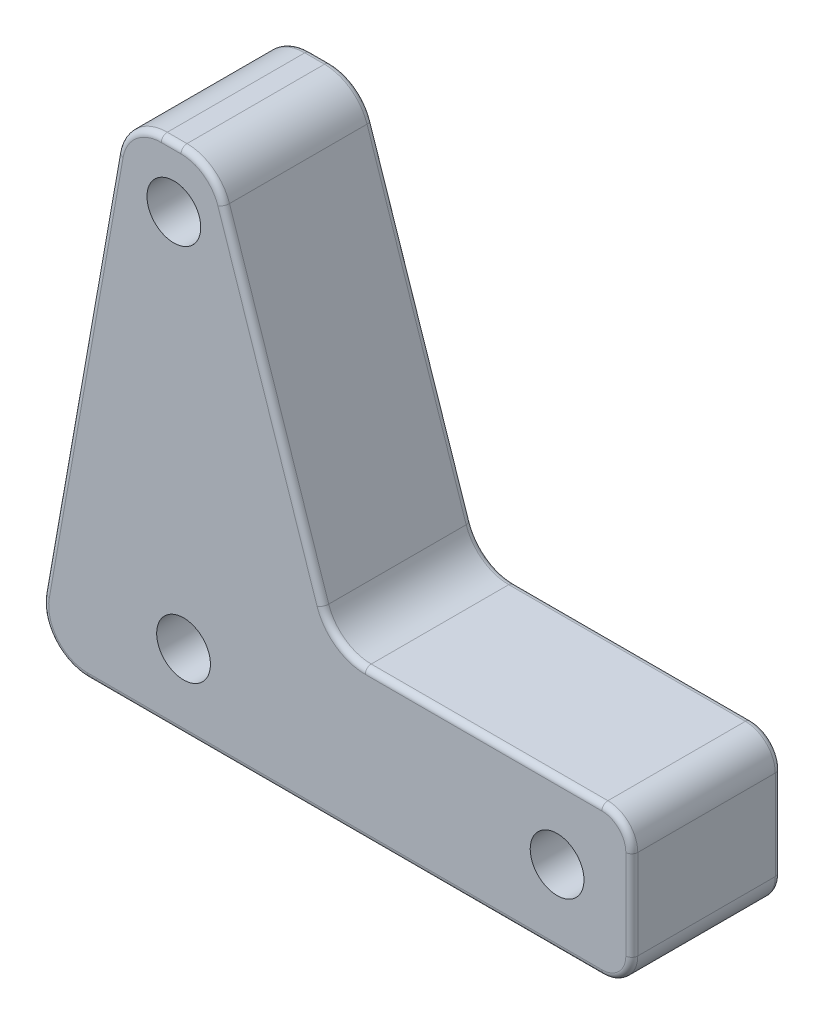
ISO-10303-21;
HEADER;
FILE_DESCRIPTION(('STEP AP214'),'2;1');
FILE_NAME('part.step','',(''),(''),'','','');
FILE_SCHEMA(('AUTOMOTIVE_DESIGN { 1 0 10303 214 1 1 1 1 }'));
ENDSEC;
DATA;
#1=APPLICATION_CONTEXT('core data for automotive mechanical design processes');
#2=APPLICATION_PROTOCOL_DEFINITION('international standard','automotive_design',2000,#1);
#3=PRODUCT_CONTEXT('',#1,'mechanical');
#4=PRODUCT('Part','Part','',(#3));
#5=PRODUCT_RELATED_PRODUCT_CATEGORY('part','',(#4));
#6=PRODUCT_DEFINITION_FORMATION('','',#4);
#7=PRODUCT_DEFINITION_CONTEXT('part definition',#1,'design');
#8=PRODUCT_DEFINITION('design','',#6,#7);
#9=PRODUCT_DEFINITION_SHAPE('','',#8);
#10=(LENGTH_UNIT() NAMED_UNIT(*) SI_UNIT(.MILLI.,.METRE.));
#11=(NAMED_UNIT(*) PLANE_ANGLE_UNIT() SI_UNIT($,.RADIAN.));
#12=(NAMED_UNIT(*) SI_UNIT($,.STERADIAN.) SOLID_ANGLE_UNIT());
#13=UNCERTAINTY_MEASURE_WITH_UNIT(LENGTH_MEASURE(1.E-05),#10,'distance_accuracy_value','');
#14=(GEOMETRIC_REPRESENTATION_CONTEXT(3) GLOBAL_UNCERTAINTY_ASSIGNED_CONTEXT((#13)) GLOBAL_UNIT_ASSIGNED_CONTEXT((#10,
#11,#12)) REPRESENTATION_CONTEXT('',''));
#15=CARTESIAN_POINT('',(0.,0.,0.));
#16=DIRECTION('',(0.,0.,1.));
#17=DIRECTION('',(1.,0.,0.));
#18=AXIS2_PLACEMENT_3D('',#15,#16,#17);
#19=CARTESIAN_POINT('',(0.,0.,12.7));
#20=DIRECTION('',(0.,0.,-1.));
#21=DIRECTION('',(-1.,0.,0.));
#22=AXIS2_PLACEMENT_3D('',#19,#20,#21);
#23=PLANE('',#22);
#24=DIRECTION('',(-1.,0.,0.));
#25=VECTOR('',#24,1.);
#26=CARTESIAN_POINT('',(0.,12.192,12.7));
#27=LINE('',#26,#25);
#28=CARTESIAN_POINT('',(48.26,12.192,12.7));
#29=VERTEX_POINT('',#28);
#30=CARTESIAN_POINT('',(28.1455626890846,12.192,12.7));
#31=VERTEX_POINT('',#30);
#32=EDGE_CURVE('E61',#29,#31,#27,.T.);
#33=ORIENTED_EDGE('',*,*,#32,.T.);
#34=CARTESIAN_POINT('',(28.1455626890846,16.51,12.7));
#35=DIRECTION('',(0.,0.,-1.));
#36=DIRECTION('',(-1.,0.,0.));
#37=AXIS2_PLACEMENT_3D('',#34,#35,#36);
#38=CIRCLE('',#37,4.318);
#39=CARTESIAN_POINT('',(24.0493982787783,15.143778523174,12.7));
#40=VERTEX_POINT('',#39);
#41=EDGE_CURVE('E370',#31,#40,#38,.T.);
#42=ORIENTED_EDGE('',*,*,#41,.T.);
#43=DIRECTION('',(-0.316401453641969,0.948625384508157,0.));
#44=VECTOR('',#43,1.);
#45=CARTESIAN_POINT('',(26.187167278929,8.73438338160695,12.7));
#46=LINE('',#45,#44);
#47=CARTESIAN_POINT('',(15.6205973575531,40.4147575999258,12.7));
#48=VERTEX_POINT('',#47);
#49=EDGE_CURVE('E339',#40,#48,#46,.T.);
#50=ORIENTED_EDGE('',*,*,#49,.T.);
#51=CARTESIAN_POINT('',(12.4882363379071,39.37,12.7));
#52=DIRECTION('',(0.,0.,-1.));
#53=DIRECTION('',(-1.,0.,0.));
#54=AXIS2_PLACEMENT_3D('',#51,#52,#53);
#55=CIRCLE('',#54,3.302);
#56=CARTESIAN_POINT('',(12.4882363379071,42.672,12.7));
#57=VERTEX_POINT('',#56);
#58=EDGE_CURVE('E342',#48,#57,#55,.F.);
#59=ORIENTED_EDGE('',*,*,#58,.T.);
#60=DIRECTION('',(-1.,0.,0.));
#61=VECTOR('',#60,1.);
#62=CARTESIAN_POINT('',(0.,42.672,12.7));
#63=LINE('',#62,#61);
#64=CARTESIAN_POINT('',(10.8107686217771,42.672,12.7));
#65=VERTEX_POINT('',#64);
#66=EDGE_CURVE('E345',#57,#65,#63,.T.);
#67=ORIENTED_EDGE('',*,*,#66,.T.);
#68=CARTESIAN_POINT('',(10.8107686217771,39.37,12.7));
#69=DIRECTION('',(0.,0.,-1.));
#70=DIRECTION('',(-1.,0.,0.));
#71=AXIS2_PLACEMENT_3D('',#68,#69,#70);
#72=CIRCLE('',#71,3.302);
#73=CARTESIAN_POINT('',(7.55893342133081,39.9433862826562,12.7));
#74=VERTEX_POINT('',#73);
#75=EDGE_CURVE('E348',#65,#74,#72,.F.);
#76=ORIENTED_EDGE('',*,*,#75,.T.);
#77=DIRECTION('',(-0.173648177666934,-0.984807753012208,0.));
#78=VECTOR('',#77,1.);
#79=CARTESIAN_POINT('',(0.500282338530202,-0.0882132742548027,12.7));
#80=LINE('',#79,#78);
#81=CARTESIAN_POINT('',(1.28874598733765,4.38338628265621,12.7));
#82=VERTEX_POINT('',#81);
#83=EDGE_CURVE('E351',#74,#82,#80,.T.);
#84=ORIENTED_EDGE('',*,*,#83,.T.);
#85=CARTESIAN_POINT('',(4.54058118778396,3.81,12.7));
#86=DIRECTION('',(0.,0.,-1.));
#87=DIRECTION('',(-1.,0.,0.));
#88=AXIS2_PLACEMENT_3D('',#85,#86,#87);
#89=CIRCLE('',#88,3.302);
#90=CARTESIAN_POINT('',(4.54058118778396,0.508,12.7));
#91=VERTEX_POINT('',#90);
#92=EDGE_CURVE('E354',#82,#91,#89,.F.);
#93=ORIENTED_EDGE('',*,*,#92,.T.);
#94=DIRECTION('',(1.,0.,0.));
#95=VECTOR('',#94,1.);
#96=CARTESIAN_POINT('',(0.,0.508,12.7));
#97=LINE('',#96,#95);
#98=CARTESIAN_POINT('',(48.26,0.508,12.7));
#99=VERTEX_POINT('',#98);
#100=EDGE_CURVE('E357',#91,#99,#97,.T.);
#101=ORIENTED_EDGE('',*,*,#100,.T.);
#102=CARTESIAN_POINT('',(48.26,2.54,12.7));
#103=DIRECTION('',(0.,0.,-1.));
#104=DIRECTION('',(-1.,0.,0.));
#105=AXIS2_PLACEMENT_3D('',#102,#103,#104);
#106=CIRCLE('',#105,2.032);
#107=CARTESIAN_POINT('',(50.292,2.54,12.7));
#108=VERTEX_POINT('',#107);
#109=EDGE_CURVE('E360',#99,#108,#106,.F.);
#110=ORIENTED_EDGE('',*,*,#109,.T.);
#111=DIRECTION('',(0.,1.,0.));
#112=VECTOR('',#111,1.);
#113=CARTESIAN_POINT('',(50.292,0.,12.7));
#114=LINE('',#113,#112);
#115=CARTESIAN_POINT('',(50.292,10.16,12.7));
#116=VERTEX_POINT('',#115);
#117=EDGE_CURVE('E363',#108,#116,#114,.T.);
#118=ORIENTED_EDGE('',*,*,#117,.T.);
#119=CARTESIAN_POINT('',(48.26,10.16,12.7));
#120=DIRECTION('',(0.,0.,-1.));
#121=DIRECTION('',(-1.,0.,0.));
#122=AXIS2_PLACEMENT_3D('',#119,#120,#121);
#123=CIRCLE('',#122,2.032);
#124=EDGE_CURVE('E66',#116,#29,#123,.F.);
#125=ORIENTED_EDGE('',*,*,#124,.T.);
#126=EDGE_LOOP('',(#33,#42,#50,#59,#67,#76,#84,#93,#101,#110,#118,#125));
#127=FACE_BOUND('',#126,.T.);
#128=CARTESIAN_POINT('',(44.45,6.35,12.7));
#129=DIRECTION('',(0.,0.,-1.));
#130=DIRECTION('',(-1.,0.,0.));
#131=AXIS2_PLACEMENT_3D('',#128,#129,#130);
#132=CIRCLE('',#131,2.286);
#133=CARTESIAN_POINT('',(42.164,6.35,12.7));
#134=VERTEX_POINT('',#133);
#135=EDGE_CURVE('E566',#134,#134,#132,.T.);
#136=ORIENTED_EDGE('',*,*,#135,.T.);
#137=EDGE_LOOP('',(#136));
#138=FACE_BOUND('',#137,.T.);
#139=CARTESIAN_POINT('',(12.7,6.35,12.7));
#140=DIRECTION('',(0.,0.,-1.));
#141=DIRECTION('',(-1.,0.,0.));
#142=AXIS2_PLACEMENT_3D('',#139,#140,#141);
#143=CIRCLE('',#142,2.286);
#144=CARTESIAN_POINT('',(10.414,6.35,12.7));
#145=VERTEX_POINT('',#144);
#146=EDGE_CURVE('E413',#145,#145,#143,.T.);
#147=ORIENTED_EDGE('',*,*,#146,.T.);
#148=EDGE_LOOP('',(#147));
#149=FACE_BOUND('',#148,.T.);
#150=CARTESIAN_POINT('',(11.8764251533723,38.1,12.7));
#151=DIRECTION('',(0.,0.,1.));
#152=DIRECTION('',(1.,0.,0.));
#153=AXIS2_PLACEMENT_3D('',#150,#151,#152);
#154=CIRCLE('',#153,2.286);
#155=CARTESIAN_POINT('',(14.1624251533723,38.1,12.7));
#156=VERTEX_POINT('',#155);
#157=EDGE_CURVE('E561',#156,#156,#154,.T.);
#158=ORIENTED_EDGE('',*,*,#157,.F.);
#159=EDGE_LOOP('',(#158));
#160=FACE_BOUND('',#159,.T.);
#161=ADVANCED_FACE('F43',(#127,#138,#149,#160),#23,.F.);
#162=CARTESIAN_POINT('',(0.,0.,0.));
#163=DIRECTION('',(0.,0.,-1.));
#164=DIRECTION('',(-1.,0.,0.));
#165=AXIS2_PLACEMENT_3D('',#162,#163,#164);
#166=PLANE('',#165);
#167=DIRECTION('',(-1.,0.,0.));
#168=VECTOR('',#167,1.);
#169=CARTESIAN_POINT('',(48.26,12.192,0.));
#170=LINE('',#169,#168);
#171=CARTESIAN_POINT('',(28.1455626890846,12.192,0.));
#172=VERTEX_POINT('',#171);
#173=CARTESIAN_POINT('',(48.26,12.192,0.));
#174=VERTEX_POINT('',#173);
#175=EDGE_CURVE('E211',#172,#174,#170,.F.);
#176=ORIENTED_EDGE('',*,*,#175,.T.);
#177=CARTESIAN_POINT('',(48.26,10.16,0.));
#178=DIRECTION('',(0.,0.,-1.));
#179=DIRECTION('',(-1.,0.,0.));
#180=AXIS2_PLACEMENT_3D('',#177,#178,#179);
#181=CIRCLE('',#180,2.032);
#182=CARTESIAN_POINT('',(50.292,10.16,0.));
#183=VERTEX_POINT('',#182);
#184=EDGE_CURVE('E269',#174,#183,#181,.T.);
#185=ORIENTED_EDGE('',*,*,#184,.T.);
#186=DIRECTION('',(0.,1.,0.));
#187=VECTOR('',#186,1.);
#188=CARTESIAN_POINT('',(50.292,2.54,0.));
#189=LINE('',#188,#187);
#190=CARTESIAN_POINT('',(50.292,2.54,0.));
#191=VERTEX_POINT('',#190);
#192=EDGE_CURVE('E266',#183,#191,#189,.F.);
#193=ORIENTED_EDGE('',*,*,#192,.T.);
#194=CARTESIAN_POINT('',(48.26,2.54,0.));
#195=DIRECTION('',(0.,0.,-1.));
#196=DIRECTION('',(-1.,0.,0.));
#197=AXIS2_PLACEMENT_3D('',#194,#195,#196);
#198=CIRCLE('',#197,2.032);
#199=CARTESIAN_POINT('',(48.26,0.508,0.));
#200=VERTEX_POINT('',#199);
#201=EDGE_CURVE('E263',#191,#200,#198,.T.);
#202=ORIENTED_EDGE('',*,*,#201,.T.);
#203=DIRECTION('',(1.,0.,0.));
#204=VECTOR('',#203,1.);
#205=CARTESIAN_POINT('',(4.54058118778396,0.508,0.));
#206=LINE('',#205,#204);
#207=CARTESIAN_POINT('',(4.54058118778396,0.508,0.));
#208=VERTEX_POINT('',#207);
#209=EDGE_CURVE('E260',#200,#208,#206,.F.);
#210=ORIENTED_EDGE('',*,*,#209,.T.);
#211=CARTESIAN_POINT('',(4.54058118778396,3.81,0.));
#212=DIRECTION('',(0.,0.,-1.));
#213=DIRECTION('',(-1.,0.,0.));
#214=AXIS2_PLACEMENT_3D('',#211,#212,#213);
#215=CIRCLE('',#214,3.302);
#216=CARTESIAN_POINT('',(1.28874598733765,4.38338628265621,0.));
#217=VERTEX_POINT('',#216);
#218=EDGE_CURVE('E257',#208,#217,#215,.T.);
#219=ORIENTED_EDGE('',*,*,#218,.T.);
#220=DIRECTION('',(-0.173648177666934,-0.984807753012208,0.));
#221=VECTOR('',#220,1.);
#222=CARTESIAN_POINT('',(7.55893342133081,39.9433862826562,0.));
#223=LINE('',#222,#221);
#224=CARTESIAN_POINT('',(7.55893342133081,39.9433862826562,0.));
#225=VERTEX_POINT('',#224);
#226=EDGE_CURVE('E254',#217,#225,#223,.F.);
#227=ORIENTED_EDGE('',*,*,#226,.T.);
#228=CARTESIAN_POINT('',(10.8107686217771,39.37,0.));
#229=DIRECTION('',(0.,0.,-1.));
#230=DIRECTION('',(-1.,0.,0.));
#231=AXIS2_PLACEMENT_3D('',#228,#229,#230);
#232=CIRCLE('',#231,3.302);
#233=CARTESIAN_POINT('',(10.8107686217771,42.672,0.));
#234=VERTEX_POINT('',#233);
#235=EDGE_CURVE('E251',#225,#234,#232,.T.);
#236=ORIENTED_EDGE('',*,*,#235,.T.);
#237=DIRECTION('',(-1.,0.,0.));
#238=VECTOR('',#237,1.);
#239=CARTESIAN_POINT('',(12.4882363379071,42.672,0.));
#240=LINE('',#239,#238);
#241=CARTESIAN_POINT('',(12.4882363379071,42.672,0.));
#242=VERTEX_POINT('',#241);
#243=EDGE_CURVE('E248',#234,#242,#240,.F.);
#244=ORIENTED_EDGE('',*,*,#243,.T.);
#245=CARTESIAN_POINT('',(12.4882363379071,39.37,0.));
#246=DIRECTION('',(0.,0.,-1.));
#247=DIRECTION('',(-1.,0.,0.));
#248=AXIS2_PLACEMENT_3D('',#245,#246,#247);
#249=CIRCLE('',#248,3.302);
#250=CARTESIAN_POINT('',(15.6205973575531,40.4147575999258,0.));
#251=VERTEX_POINT('',#250);
#252=EDGE_CURVE('E245',#242,#251,#249,.T.);
#253=ORIENTED_EDGE('',*,*,#252,.T.);
#254=DIRECTION('',(-0.316401453641969,0.948625384508157,0.));
#255=VECTOR('',#254,1.);
#256=CARTESIAN_POINT('',(24.0493982787783,15.143778523174,0.));
#257=LINE('',#256,#255);
#258=CARTESIAN_POINT('',(24.0493982787783,15.143778523174,0.));
#259=VERTEX_POINT('',#258);
#260=EDGE_CURVE('E214',#251,#259,#257,.F.);
#261=ORIENTED_EDGE('',*,*,#260,.T.);
#262=CARTESIAN_POINT('',(28.1455626890846,16.51,0.));
#263=DIRECTION('',(0.,0.,-1.));
#264=DIRECTION('',(-1.,0.,0.));
#265=AXIS2_PLACEMENT_3D('',#262,#263,#264);
#266=CIRCLE('',#265,4.318);
#267=EDGE_CURVE('E205',#259,#172,#266,.F.);
#268=ORIENTED_EDGE('',*,*,#267,.T.);
#269=EDGE_LOOP('',(#176,#185,#193,#202,#210,#219,#227,#236,#244,#253,#261,#268));
#270=FACE_BOUND('',#269,.T.);
#271=CARTESIAN_POINT('',(44.45,6.35,0.));
#272=DIRECTION('',(0.,0.,-1.));
#273=DIRECTION('',(-1.,0.,0.));
#274=AXIS2_PLACEMENT_3D('',#271,#272,#273);
#275=CIRCLE('',#274,2.286);
#276=CARTESIAN_POINT('',(42.164,6.35,0.));
#277=VERTEX_POINT('',#276);
#278=EDGE_CURVE('E577',#277,#277,#275,.T.);
#279=ORIENTED_EDGE('',*,*,#278,.F.);
#280=EDGE_LOOP('',(#279));
#281=FACE_BOUND('',#280,.T.);
#282=CARTESIAN_POINT('',(12.7,6.35,0.));
#283=DIRECTION('',(0.,0.,-1.));
#284=DIRECTION('',(-1.,0.,0.));
#285=AXIS2_PLACEMENT_3D('',#282,#283,#284);
#286=CIRCLE('',#285,2.286);
#287=CARTESIAN_POINT('',(10.414,6.35,0.));
#288=VERTEX_POINT('',#287);
#289=EDGE_CURVE('E573',#288,#288,#286,.T.);
#290=ORIENTED_EDGE('',*,*,#289,.F.);
#291=EDGE_LOOP('',(#290));
#292=FACE_BOUND('',#291,.T.);
#293=CARTESIAN_POINT('',(11.8764251533723,38.1,0.));
#294=DIRECTION('',(0.,0.,1.));
#295=DIRECTION('',(1.,0.,0.));
#296=AXIS2_PLACEMENT_3D('',#293,#294,#295);
#297=CIRCLE('',#296,2.286);
#298=CARTESIAN_POINT('',(14.1624251533723,38.1,0.));
#299=VERTEX_POINT('',#298);
#300=EDGE_CURVE('E562',#299,#299,#297,.T.);
#301=ORIENTED_EDGE('',*,*,#300,.T.);
#302=EDGE_LOOP('',(#301));
#303=FACE_BOUND('',#302,.T.);
#304=ADVANCED_FACE('F207',(#270,#281,#292,#303),#166,.T.);
#305=CARTESIAN_POINT('',(0.,0.,12.7));
#306=DIRECTION('',(0.,1.,0.));
#307=DIRECTION('',(0.,0.,1.));
#308=AXIS2_PLACEMENT_3D('',#305,#306,#307);
#309=PLANE('',#308);
#310=DIRECTION('',(0.,0.,-1.));
#311=VECTOR('',#310,1.);
#312=CARTESIAN_POINT('',(4.54058118778396,0.,12.7));
#313=LINE('',#312,#311);
#314=CARTESIAN_POINT('',(4.54058118778396,0.,12.192));
#315=VERTEX_POINT('',#314);
#316=CARTESIAN_POINT('',(4.54058118778396,0.,0.508));
#317=VERTEX_POINT('',#316);
#318=EDGE_CURVE('E477',#315,#317,#313,.T.);
#319=ORIENTED_EDGE('',*,*,#318,.T.);
#320=DIRECTION('',(1.,0.,0.));
#321=VECTOR('',#320,1.);
#322=CARTESIAN_POINT('',(48.26,0.,0.508));
#323=LINE('',#322,#321);
#324=CARTESIAN_POINT('',(48.26,0.,0.508));
#325=VERTEX_POINT('',#324);
#326=EDGE_CURVE('E294',#317,#325,#323,.T.);
#327=ORIENTED_EDGE('',*,*,#326,.T.);
#328=DIRECTION('',(0.,0.,-1.));
#329=VECTOR('',#328,1.);
#330=CARTESIAN_POINT('',(48.26,0.,12.7));
#331=LINE('',#330,#329);
#332=CARTESIAN_POINT('',(48.26,0.,12.192));
#333=VERTEX_POINT('',#332);
#334=EDGE_CURVE('E239',#325,#333,#331,.F.);
#335=ORIENTED_EDGE('',*,*,#334,.T.);
#336=DIRECTION('',(1.,0.,0.));
#337=VECTOR('',#336,1.);
#338=CARTESIAN_POINT('',(0.,0.,12.192));
#339=LINE('',#338,#337);
#340=EDGE_CURVE('E291',#333,#315,#339,.F.);
#341=ORIENTED_EDGE('',*,*,#340,.T.);
#342=EDGE_LOOP('',(#319,#327,#335,#341));
#343=FACE_BOUND('',#342,.T.);
#344=ADVANCED_FACE('F501',(#343),#309,.F.);
#345=CARTESIAN_POINT('',(50.8,12.7,12.7));
#346=DIRECTION('',(-1.,0.,0.));
#347=DIRECTION('',(0.,0.,1.));
#348=AXIS2_PLACEMENT_3D('',#345,#346,#347);
#349=PLANE('',#348);
#350=DIRECTION('',(0.,0.,-1.));
#351=VECTOR('',#350,1.);
#352=CARTESIAN_POINT('',(50.8,2.54,12.7));
#353=LINE('',#352,#351);
#354=CARTESIAN_POINT('',(50.8,2.54,12.192));
#355=VERTEX_POINT('',#354);
#356=CARTESIAN_POINT('',(50.8,2.54,0.508));
#357=VERTEX_POINT('',#356);
#358=EDGE_CURVE('E490',#355,#357,#353,.T.);
#359=ORIENTED_EDGE('',*,*,#358,.T.);
#360=DIRECTION('',(0.,1.,0.));
#361=VECTOR('',#360,1.);
#362=CARTESIAN_POINT('',(50.8,10.16,0.508));
#363=LINE('',#362,#361);
#364=CARTESIAN_POINT('',(50.8,10.16,0.508));
#365=VERTEX_POINT('',#364);
#366=EDGE_CURVE('E282',#357,#365,#363,.T.);
#367=ORIENTED_EDGE('',*,*,#366,.T.);
#368=DIRECTION('',(0.,0.,-1.));
#369=VECTOR('',#368,1.);
#370=CARTESIAN_POINT('',(50.8,10.16,12.7));
#371=LINE('',#370,#369);
#372=CARTESIAN_POINT('',(50.8,10.16,12.192));
#373=VERTEX_POINT('',#372);
#374=EDGE_CURVE('E484',#365,#373,#371,.F.);
#375=ORIENTED_EDGE('',*,*,#374,.T.);
#376=DIRECTION('',(0.,1.,0.));
#377=VECTOR('',#376,1.);
#378=CARTESIAN_POINT('',(50.8,12.7,12.192));
#379=LINE('',#378,#377);
#380=EDGE_CURVE('E279',#373,#355,#379,.F.);
#381=ORIENTED_EDGE('',*,*,#380,.T.);
#382=EDGE_LOOP('',(#359,#367,#375,#381));
#383=FACE_BOUND('',#382,.T.);
#384=ADVANCED_FACE('F523',(#383),#349,.F.);
#385=CARTESIAN_POINT('',(25.4,12.7,12.7));
#386=DIRECTION('',(0.,-1.,0.));
#387=DIRECTION('',(0.,0.,-1.));
#388=AXIS2_PLACEMENT_3D('',#385,#386,#387);
#389=PLANE('',#388);
#390=DIRECTION('',(0.,0.,-1.));
#391=VECTOR('',#390,1.);
#392=CARTESIAN_POINT('',(28.1455626890846,12.7,12.7));
#393=LINE('',#392,#391);
#394=CARTESIAN_POINT('',(28.1455626890846,12.7,0.508));
#395=VERTEX_POINT('',#394);
#396=CARTESIAN_POINT('',(28.1455626890846,12.7,12.192));
#397=VERTEX_POINT('',#396);
#398=EDGE_CURVE('E536',#395,#397,#393,.F.);
#399=ORIENTED_EDGE('',*,*,#398,.T.);
#400=DIRECTION('',(-1.,0.,0.));
#401=VECTOR('',#400,1.);
#402=CARTESIAN_POINT('',(25.4,12.7,12.192));
#403=LINE('',#402,#401);
#404=CARTESIAN_POINT('',(48.26,12.7,12.192));
#405=VERTEX_POINT('',#404);
#406=EDGE_CURVE('E11',#397,#405,#403,.F.);
#407=ORIENTED_EDGE('',*,*,#406,.T.);
#408=DIRECTION('',(0.,0.,-1.));
#409=VECTOR('',#408,1.);
#410=CARTESIAN_POINT('',(48.26,12.7,12.7));
#411=LINE('',#410,#409);
#412=CARTESIAN_POINT('',(48.26,12.7,0.508));
#413=VERTEX_POINT('',#412);
#414=EDGE_CURVE('E235',#405,#413,#411,.T.);
#415=ORIENTED_EDGE('',*,*,#414,.T.);
#416=DIRECTION('',(-1.,0.,0.));
#417=VECTOR('',#416,1.);
#418=CARTESIAN_POINT('',(28.1455626890846,12.7,0.508));
#419=LINE('',#418,#417);
#420=EDGE_CURVE('E53',#413,#395,#419,.T.);
#421=ORIENTED_EDGE('',*,*,#420,.T.);
#422=EDGE_LOOP('',(#399,#407,#415,#421));
#423=FACE_BOUND('',#422,.T.);
#424=ADVANCED_FACE('F535',(#423),#389,.F.);
#425=CARTESIAN_POINT('',(15.2337990269917,43.18,12.7));
#426=DIRECTION('',(-0.948625384508157,-0.316401453641969,0.));
#427=DIRECTION('',(0.316401453641969,-0.948625384508157,0.));
#428=AXIS2_PLACEMENT_3D('',#425,#426,#427);
#429=PLANE('',#428);
#430=DIRECTION('',(0.,0.,-1.));
#431=VECTOR('',#430,1.);
#432=CARTESIAN_POINT('',(24.5312999741085,15.3045104616241,0.));
#433=LINE('',#432,#431);
#434=CARTESIAN_POINT('',(24.5312999741085,15.3045104616241,12.192));
#435=VERTEX_POINT('',#434);
#436=CARTESIAN_POINT('',(24.5312999741085,15.3045104616241,0.508));
#437=VERTEX_POINT('',#436);
#438=EDGE_CURVE('E548',#435,#437,#433,.T.);
#439=ORIENTED_EDGE('',*,*,#438,.T.);
#440=DIRECTION('',(-0.316401453641969,0.948625384508157,0.));
#441=VECTOR('',#440,1.);
#442=CARTESIAN_POINT('',(16.1024990528832,40.5754895383759,0.508));
#443=LINE('',#442,#441);
#444=CARTESIAN_POINT('',(16.1024990528832,40.5754895383759,0.508));
#445=VERTEX_POINT('',#444);
#446=EDGE_CURVE('E330',#437,#445,#443,.T.);
#447=ORIENTED_EDGE('',*,*,#446,.T.);
#448=DIRECTION('',(0.,0.,-1.));
#449=VECTOR('',#448,1.);
#450=CARTESIAN_POINT('',(16.1024990528832,40.5754895383759,12.7));
#451=LINE('',#450,#449);
#452=CARTESIAN_POINT('',(16.1024990528832,40.5754895383759,12.192));
#453=VERTEX_POINT('',#452);
#454=EDGE_CURVE('E543',#445,#453,#451,.F.);
#455=ORIENTED_EDGE('',*,*,#454,.T.);
#456=DIRECTION('',(-0.316401453641969,0.948625384508157,0.));
#457=VECTOR('',#456,1.);
#458=CARTESIAN_POINT('',(15.2337990269917,43.18,12.192));
#459=LINE('',#458,#457);
#460=EDGE_CURVE('E327',#453,#435,#459,.F.);
#461=ORIENTED_EDGE('',*,*,#460,.T.);
#462=EDGE_LOOP('',(#439,#447,#455,#461));
#463=FACE_BOUND('',#462,.T.);
#464=ADVANCED_FACE('F622',(#463),#429,.F.);
#465=CARTESIAN_POINT('',(7.61379902699169,43.18,12.7));
#466=DIRECTION('',(0.,-1.,0.));
#467=DIRECTION('',(0.,0.,-1.));
#468=AXIS2_PLACEMENT_3D('',#465,#466,#467);
#469=PLANE('',#468);
#470=DIRECTION('',(0.,0.,-1.));
#471=VECTOR('',#470,1.);
#472=CARTESIAN_POINT('',(12.4882363379071,43.18,12.7));
#473=LINE('',#472,#471);
#474=CARTESIAN_POINT('',(12.4882363379071,43.18,12.192));
#475=VERTEX_POINT('',#474);
#476=CARTESIAN_POINT('',(12.4882363379071,43.18,0.508));
#477=VERTEX_POINT('',#476);
#478=EDGE_CURVE('E553',#475,#477,#473,.T.);
#479=ORIENTED_EDGE('',*,*,#478,.T.);
#480=DIRECTION('',(-1.,0.,0.));
#481=VECTOR('',#480,1.);
#482=CARTESIAN_POINT('',(10.8107686217771,43.18,0.508));
#483=LINE('',#482,#481);
#484=CARTESIAN_POINT('',(10.8107686217771,43.18,0.508));
#485=VERTEX_POINT('',#484);
#486=EDGE_CURVE('E318',#477,#485,#483,.T.);
#487=ORIENTED_EDGE('',*,*,#486,.T.);
#488=DIRECTION('',(0.,0.,-1.));
#489=VECTOR('',#488,1.);
#490=CARTESIAN_POINT('',(10.8107686217771,43.18,12.7));
#491=LINE('',#490,#489);
#492=CARTESIAN_POINT('',(10.8107686217771,43.18,12.192));
#493=VERTEX_POINT('',#492);
#494=EDGE_CURVE('E557',#485,#493,#491,.F.);
#495=ORIENTED_EDGE('',*,*,#494,.T.);
#496=DIRECTION('',(-1.,0.,0.));
#497=VECTOR('',#496,1.);
#498=CARTESIAN_POINT('',(7.61379902699169,43.18,12.192));
#499=LINE('',#498,#497);
#500=EDGE_CURVE('E315',#493,#475,#499,.F.);
#501=ORIENTED_EDGE('',*,*,#500,.T.);
#502=EDGE_LOOP('',(#479,#487,#495,#501));
#503=FACE_BOUND('',#502,.T.);
#504=ADVANCED_FACE('F612',(#503),#469,.F.);
#505=CARTESIAN_POINT('',(7.61379902699169,43.18,12.7));
#506=DIRECTION('',(0.984807753012207,-0.173648177666934,0.));
#507=DIRECTION('',(0.173648177666934,0.984807753012208,0.));
#508=AXIS2_PLACEMENT_3D('',#505,#506,#507);
#509=PLANE('',#508);
#510=DIRECTION('',(0.,0.,-1.));
#511=VECTOR('',#510,1.);
#512=CARTESIAN_POINT('',(7.05865108280061,40.031599556911,12.7));
#513=LINE('',#512,#511);
#514=CARTESIAN_POINT('',(7.05865108280061,40.031599556911,12.192));
#515=VERTEX_POINT('',#514);
#516=CARTESIAN_POINT('',(7.05865108280061,40.031599556911,0.508));
#517=VERTEX_POINT('',#516);
#518=EDGE_CURVE('E485',#515,#517,#513,.T.);
#519=ORIENTED_EDGE('',*,*,#518,.T.);
#520=DIRECTION('',(-0.173648177666934,-0.984807753012208,0.));
#521=VECTOR('',#520,1.);
#522=CARTESIAN_POINT('',(0.788463648807446,4.471599556911,0.508));
#523=LINE('',#522,#521);
#524=CARTESIAN_POINT('',(0.788463648807449,4.47159955691102,0.508));
#525=VERTEX_POINT('',#524);
#526=EDGE_CURVE('E306',#517,#525,#523,.T.);
#527=ORIENTED_EDGE('',*,*,#526,.T.);
#528=DIRECTION('',(0.,0.,-1.));
#529=VECTOR('',#528,1.);
#530=CARTESIAN_POINT('',(0.788463648807449,4.47159955691102,12.7));
#531=LINE('',#530,#529);
#532=CARTESIAN_POINT('',(0.788463648807449,4.47159955691102,12.192));
#533=VERTEX_POINT('',#532);
#534=EDGE_CURVE('E474',#525,#533,#531,.F.);
#535=ORIENTED_EDGE('',*,*,#534,.T.);
#536=DIRECTION('',(-0.173648177666934,-0.984807753012208,0.));
#537=VECTOR('',#536,1.);
#538=CARTESIAN_POINT('',(7.61379902699169,43.18,12.192));
#539=LINE('',#538,#537);
#540=EDGE_CURVE('E303',#533,#515,#539,.F.);
#541=ORIENTED_EDGE('',*,*,#540,.T.);
#542=EDGE_LOOP('',(#519,#527,#535,#541));
#543=FACE_BOUND('',#542,.T.);
#544=ADVANCED_FACE('F480',(#543),#509,.F.);
#545=CARTESIAN_POINT('',(11.8764251533723,38.1,12.7));
#546=DIRECTION('',(0.,0.,-1.));
#547=DIRECTION('',(-1.,0.,0.));
#548=AXIS2_PLACEMENT_3D('',#545,#546,#547);
#549=CYLINDRICAL_SURFACE('',#548,2.286);
#550=ORIENTED_EDGE('',*,*,#157,.T.);
#551=EDGE_LOOP('',(#550));
#552=FACE_BOUND('',#551,.T.);
#553=ORIENTED_EDGE('',*,*,#300,.F.);
#554=EDGE_LOOP('',(#553));
#555=FACE_BOUND('',#554,.T.);
#556=ADVANCED_FACE('F601',(#552,#555),#549,.F.);
#557=CARTESIAN_POINT('',(12.4882363379071,39.37,12.7));
#558=DIRECTION('',(0.,0.,-1.));
#559=DIRECTION('',(-1.,0.,0.));
#560=AXIS2_PLACEMENT_3D('',#557,#558,#559);
#561=CYLINDRICAL_SURFACE('',#560,3.81);
#562=ORIENTED_EDGE('',*,*,#454,.F.);
#563=CARTESIAN_POINT('',(12.4882363379071,39.37,0.508));
#564=DIRECTION('',(0.,0.,-1.));
#565=DIRECTION('',(-1.,0.,0.));
#566=AXIS2_PLACEMENT_3D('',#563,#564,#565);
#567=CIRCLE('',#566,3.81);
#568=EDGE_CURVE('E324',#445,#477,#567,.F.);
#569=ORIENTED_EDGE('',*,*,#568,.T.);
#570=ORIENTED_EDGE('',*,*,#478,.F.);
#571=CARTESIAN_POINT('',(12.4882363379071,39.37,12.192));
#572=DIRECTION('',(0.,0.,-1.));
#573=DIRECTION('',(-1.,0.,0.));
#574=AXIS2_PLACEMENT_3D('',#571,#572,#573);
#575=CIRCLE('',#574,3.81);
#576=EDGE_CURVE('E321',#475,#453,#575,.T.);
#577=ORIENTED_EDGE('',*,*,#576,.T.);
#578=EDGE_LOOP('',(#562,#569,#570,#577));
#579=FACE_BOUND('',#578,.T.);
#580=ADVANCED_FACE('F603',(#579),#561,.T.);
#581=CARTESIAN_POINT('',(28.1455626890846,16.51,12.7));
#582=DIRECTION('',(0.,0.,1.));
#583=DIRECTION('',(1.,0.,0.));
#584=AXIS2_PLACEMENT_3D('',#581,#582,#583);
#585=CYLINDRICAL_SURFACE('',#584,3.81);
#586=ORIENTED_EDGE('',*,*,#398,.F.);
#587=CARTESIAN_POINT('',(28.1455626890846,16.51,0.508));
#588=DIRECTION('',(0.,0.,-1.));
#589=DIRECTION('',(-1.,0.,0.));
#590=AXIS2_PLACEMENT_3D('',#587,#588,#589);
#591=CIRCLE('',#590,3.81);
#592=EDGE_CURVE('E224',#395,#437,#591,.T.);
#593=ORIENTED_EDGE('',*,*,#592,.T.);
#594=ORIENTED_EDGE('',*,*,#438,.F.);
#595=CARTESIAN_POINT('',(28.1455626890846,16.51,12.192));
#596=DIRECTION('',(0.,0.,-1.));
#597=DIRECTION('',(-1.,0.,0.));
#598=AXIS2_PLACEMENT_3D('',#595,#596,#597);
#599=CIRCLE('',#598,3.81);
#600=EDGE_CURVE('E333',#435,#397,#599,.F.);
#601=ORIENTED_EDGE('',*,*,#600,.T.);
#602=EDGE_LOOP('',(#586,#593,#594,#601));
#603=FACE_BOUND('',#602,.T.);
#604=ADVANCED_FACE('F538',(#603),#585,.F.);
#605=CARTESIAN_POINT('',(4.54058118778396,3.81,12.7));
#606=DIRECTION('',(0.,0.,-1.));
#607=DIRECTION('',(-1.,0.,0.));
#608=AXIS2_PLACEMENT_3D('',#605,#606,#607);
#609=CYLINDRICAL_SURFACE('',#608,3.81);
#610=ORIENTED_EDGE('',*,*,#534,.F.);
#611=CARTESIAN_POINT('',(4.54058118778396,3.81,0.508));
#612=DIRECTION('',(0.,0.,-1.));
#613=DIRECTION('',(-1.,0.,0.));
#614=AXIS2_PLACEMENT_3D('',#611,#612,#613);
#615=CIRCLE('',#614,3.81);
#616=EDGE_CURVE('E300',#525,#317,#615,.F.);
#617=ORIENTED_EDGE('',*,*,#616,.T.);
#618=ORIENTED_EDGE('',*,*,#318,.F.);
#619=CARTESIAN_POINT('',(4.54058118778396,3.81,12.192));
#620=DIRECTION('',(0.,0.,-1.));
#621=DIRECTION('',(-1.,0.,0.));
#622=AXIS2_PLACEMENT_3D('',#619,#620,#621);
#623=CIRCLE('',#622,3.81);
#624=EDGE_CURVE('E297',#315,#533,#623,.T.);
#625=ORIENTED_EDGE('',*,*,#624,.T.);
#626=EDGE_LOOP('',(#610,#617,#618,#625));
#627=FACE_BOUND('',#626,.T.);
#628=ADVANCED_FACE('F473',(#627),#609,.T.);
#629=CARTESIAN_POINT('',(10.8107686217771,39.37,12.7));
#630=DIRECTION('',(0.,0.,-1.));
#631=DIRECTION('',(-1.,0.,0.));
#632=AXIS2_PLACEMENT_3D('',#629,#630,#631);
#633=CYLINDRICAL_SURFACE('',#632,3.81);
#634=ORIENTED_EDGE('',*,*,#494,.F.);
#635=CARTESIAN_POINT('',(10.8107686217771,39.37,0.508));
#636=DIRECTION('',(0.,0.,-1.));
#637=DIRECTION('',(-1.,0.,0.));
#638=AXIS2_PLACEMENT_3D('',#635,#636,#637);
#639=CIRCLE('',#638,3.81);
#640=EDGE_CURVE('E312',#485,#517,#639,.F.);
#641=ORIENTED_EDGE('',*,*,#640,.T.);
#642=ORIENTED_EDGE('',*,*,#518,.F.);
#643=CARTESIAN_POINT('',(10.8107686217771,39.37,12.192));
#644=DIRECTION('',(0.,0.,-1.));
#645=DIRECTION('',(-1.,0.,0.));
#646=AXIS2_PLACEMENT_3D('',#643,#644,#645);
#647=CIRCLE('',#646,3.81);
#648=EDGE_CURVE('E309',#515,#493,#647,.T.);
#649=ORIENTED_EDGE('',*,*,#648,.T.);
#650=EDGE_LOOP('',(#634,#641,#642,#649));
#651=FACE_BOUND('',#650,.T.);
#652=ADVANCED_FACE('F637',(#651),#633,.T.);
#653=CARTESIAN_POINT('',(48.26,2.54,12.7));
#654=DIRECTION('',(0.,0.,-1.));
#655=DIRECTION('',(-1.,0.,0.));
#656=AXIS2_PLACEMENT_3D('',#653,#654,#655);
#657=CYLINDRICAL_SURFACE('',#656,2.54);
#658=ORIENTED_EDGE('',*,*,#334,.F.);
#659=CARTESIAN_POINT('',(48.26,2.54,0.508));
#660=DIRECTION('',(0.,0.,-1.));
#661=DIRECTION('',(-1.,0.,0.));
#662=AXIS2_PLACEMENT_3D('',#659,#660,#661);
#663=CIRCLE('',#662,2.54);
#664=EDGE_CURVE('E288',#325,#357,#663,.F.);
#665=ORIENTED_EDGE('',*,*,#664,.T.);
#666=ORIENTED_EDGE('',*,*,#358,.F.);
#667=CARTESIAN_POINT('',(48.26,2.54,12.192));
#668=DIRECTION('',(0.,0.,-1.));
#669=DIRECTION('',(-1.,0.,0.));
#670=AXIS2_PLACEMENT_3D('',#667,#668,#669);
#671=CIRCLE('',#670,2.54);
#672=EDGE_CURVE('E285',#355,#333,#671,.T.);
#673=ORIENTED_EDGE('',*,*,#672,.T.);
#674=EDGE_LOOP('',(#658,#665,#666,#673));
#675=FACE_BOUND('',#674,.T.);
#676=ADVANCED_FACE('F505',(#675),#657,.T.);
#677=CARTESIAN_POINT('',(48.26,10.16,12.7));
#678=DIRECTION('',(0.,0.,-1.));
#679=DIRECTION('',(-1.,0.,0.));
#680=AXIS2_PLACEMENT_3D('',#677,#678,#679);
#681=CYLINDRICAL_SURFACE('',#680,2.54);
#682=ORIENTED_EDGE('',*,*,#374,.F.);
#683=CARTESIAN_POINT('',(48.26,10.16,0.508));
#684=DIRECTION('',(0.,0.,-1.));
#685=DIRECTION('',(-1.,0.,0.));
#686=AXIS2_PLACEMENT_3D('',#683,#684,#685);
#687=CIRCLE('',#686,2.54);
#688=EDGE_CURVE('E275',#365,#413,#687,.F.);
#689=ORIENTED_EDGE('',*,*,#688,.T.);
#690=ORIENTED_EDGE('',*,*,#414,.F.);
#691=CARTESIAN_POINT('',(48.26,10.16,12.192));
#692=DIRECTION('',(0.,0.,-1.));
#693=DIRECTION('',(-1.,0.,0.));
#694=AXIS2_PLACEMENT_3D('',#691,#692,#693);
#695=CIRCLE('',#694,2.54);
#696=EDGE_CURVE('E272',#405,#373,#695,.T.);
#697=ORIENTED_EDGE('',*,*,#696,.T.);
#698=EDGE_LOOP('',(#682,#689,#690,#697));
#699=FACE_BOUND('',#698,.T.);
#700=ADVANCED_FACE('F527',(#699),#681,.T.);
#701=CARTESIAN_POINT('',(12.7,6.35,12.7));
#702=DIRECTION('',(0.,0.,-1.));
#703=DIRECTION('',(-1.,0.,0.));
#704=AXIS2_PLACEMENT_3D('',#701,#702,#703);
#705=CYLINDRICAL_SURFACE('',#704,2.286);
#706=ORIENTED_EDGE('',*,*,#146,.F.);
#707=EDGE_LOOP('',(#706));
#708=FACE_BOUND('',#707,.T.);
#709=ORIENTED_EDGE('',*,*,#289,.T.);
#710=EDGE_LOOP('',(#709));
#711=FACE_BOUND('',#710,.T.);
#712=ADVANCED_FACE('F591',(#708,#711),#705,.F.);
#713=CARTESIAN_POINT('',(44.45,6.35,12.7));
#714=DIRECTION('',(0.,0.,-1.));
#715=DIRECTION('',(-1.,0.,0.));
#716=AXIS2_PLACEMENT_3D('',#713,#714,#715);
#717=CYLINDRICAL_SURFACE('',#716,2.286);
#718=ORIENTED_EDGE('',*,*,#135,.F.);
#719=EDGE_LOOP('',(#718));
#720=FACE_BOUND('',#719,.T.);
#721=ORIENTED_EDGE('',*,*,#278,.T.);
#722=EDGE_LOOP('',(#721));
#723=FACE_BOUND('',#722,.T.);
#724=ADVANCED_FACE('F587',(#720,#723),#717,.F.);
#725=CARTESIAN_POINT('',(10.8107686217771,39.37,0.508));
#726=DIRECTION('',(0.,0.,-1.));
#727=DIRECTION('',(-1.,0.,0.));
#728=AXIS2_PLACEMENT_3D('',#725,#726,#727);
#729=TOROIDAL_SURFACE('',#728,3.302,0.508);
#730=CARTESIAN_POINT('',(7.55893342133081,39.9433862826562,0.508));
#731=DIRECTION('',(-0.173648177666935,-0.984807753012207,0.));
#732=DIRECTION('',(0.984807753012207,-0.173648177666935,0.));
#733=AXIS2_PLACEMENT_3D('',#730,#731,#732);
#734=CIRCLE('',#733,0.508);
#735=EDGE_CURVE('E405',#517,#225,#734,.T.);
#736=ORIENTED_EDGE('',*,*,#735,.F.);
#737=ORIENTED_EDGE('',*,*,#640,.F.);
#738=CARTESIAN_POINT('',(10.8107686217771,42.672,0.508));
#739=DIRECTION('',(1.,0.,0.));
#740=DIRECTION('',(0.,0.,-1.));
#741=AXIS2_PLACEMENT_3D('',#738,#739,#740);
#742=CIRCLE('',#741,0.508);
#743=EDGE_CURVE('E409',#234,#485,#742,.T.);
#744=ORIENTED_EDGE('',*,*,#743,.F.);
#745=ORIENTED_EDGE('',*,*,#235,.F.);
#746=EDGE_LOOP('',(#736,#737,#744,#745));
#747=FACE_BOUND('',#746,.T.);
#748=ADVANCED_FACE('F590',(#747),#729,.T.);
#749=CARTESIAN_POINT('',(7.61379902699169,42.672,0.508));
#750=DIRECTION('',(1.,0.,0.));
#751=DIRECTION('',(0.,0.,-1.));
#752=AXIS2_PLACEMENT_3D('',#749,#750,#751);
#753=CYLINDRICAL_SURFACE('',#752,0.508);
#754=ORIENTED_EDGE('',*,*,#743,.T.);
#755=ORIENTED_EDGE('',*,*,#486,.F.);
#756=CARTESIAN_POINT('',(12.4882363379071,42.672,0.508));
#757=DIRECTION('',(1.,0.,0.));
#758=DIRECTION('',(0.,0.,-1.));
#759=AXIS2_PLACEMENT_3D('',#756,#757,#758);
#760=CIRCLE('',#759,0.508);
#761=EDGE_CURVE('E401',#242,#477,#760,.T.);
#762=ORIENTED_EDGE('',*,*,#761,.F.);
#763=ORIENTED_EDGE('',*,*,#243,.F.);
#764=EDGE_LOOP('',(#754,#755,#762,#763));
#765=FACE_BOUND('',#764,.T.);
#766=ADVANCED_FACE('F672',(#765),#753,.T.);
#767=CARTESIAN_POINT('',(8.11408136552189,43.0917867257452,0.508));
#768=DIRECTION('',(0.173648177666934,0.984807753012208,0.));
#769=DIRECTION('',(-0.984807753012207,0.173648177666934,0.));
#770=AXIS2_PLACEMENT_3D('',#767,#768,#769);
#771=CYLINDRICAL_SURFACE('',#770,0.508);
#772=ORIENTED_EDGE('',*,*,#735,.T.);
#773=ORIENTED_EDGE('',*,*,#226,.F.);
#774=CARTESIAN_POINT('',(1.28874598733765,4.38338628265621,0.508));
#775=DIRECTION('',(-0.173648177666933,-0.984807753012207,0.));
#776=DIRECTION('',(0.984807753012208,-0.173648177666933,0.));
#777=AXIS2_PLACEMENT_3D('',#774,#775,#776);
#778=CIRCLE('',#777,0.508);
#779=EDGE_CURVE('E397',#525,#217,#778,.T.);
#780=ORIENTED_EDGE('',*,*,#779,.F.);
#781=ORIENTED_EDGE('',*,*,#526,.F.);
#782=EDGE_LOOP('',(#772,#773,#780,#781));
#783=FACE_BOUND('',#782,.T.);
#784=ADVANCED_FACE('F668',(#783),#771,.T.);
#785=CARTESIAN_POINT('',(12.4882363379071,39.37,0.508));
#786=DIRECTION('',(0.,0.,-1.));
#787=DIRECTION('',(-1.,0.,0.));
#788=AXIS2_PLACEMENT_3D('',#785,#786,#787);
#789=TOROIDAL_SURFACE('',#788,3.302,0.508);
#790=ORIENTED_EDGE('',*,*,#761,.T.);
#791=ORIENTED_EDGE('',*,*,#568,.F.);
#792=CARTESIAN_POINT('',(15.6205973575531,40.4147575999258,0.508));
#793=DIRECTION('',(0.316401453641969,-0.948625384508157,0.));
#794=DIRECTION('',(0.948625384508157,0.316401453641969,0.));
#795=AXIS2_PLACEMENT_3D('',#792,#793,#794);
#796=CIRCLE('',#795,0.508);
#797=EDGE_CURVE('E393',#251,#445,#796,.T.);
#798=ORIENTED_EDGE('',*,*,#797,.F.);
#799=ORIENTED_EDGE('',*,*,#252,.F.);
#800=EDGE_LOOP('',(#790,#791,#798,#799));
#801=FACE_BOUND('',#800,.T.);
#802=ADVANCED_FACE('F664',(#801),#789,.T.);
#803=CARTESIAN_POINT('',(4.54058118778396,3.81,0.508));
#804=DIRECTION('',(0.,0.,-1.));
#805=DIRECTION('',(-1.,0.,0.));
#806=AXIS2_PLACEMENT_3D('',#803,#804,#805);
#807=TOROIDAL_SURFACE('',#806,3.302,0.508);
#808=ORIENTED_EDGE('',*,*,#779,.T.);
#809=ORIENTED_EDGE('',*,*,#218,.F.);
#810=CARTESIAN_POINT('',(4.54058118778396,0.508,0.508));
#811=DIRECTION('',(1.,0.,0.));
#812=DIRECTION('',(0.,0.,-1.));
#813=AXIS2_PLACEMENT_3D('',#810,#811,#812);
#814=CIRCLE('',#813,0.508);
#815=EDGE_CURVE('E389',#317,#208,#814,.T.);
#816=ORIENTED_EDGE('',*,*,#815,.F.);
#817=ORIENTED_EDGE('',*,*,#616,.F.);
#818=EDGE_LOOP('',(#808,#809,#816,#817));
#819=FACE_BOUND('',#818,.T.);
#820=ADVANCED_FACE('F660',(#819),#807,.T.);
#821=CARTESIAN_POINT('',(14.7518973316615,43.0192680615499,0.508));
#822=DIRECTION('',(0.316401453641969,-0.948625384508157,0.));
#823=DIRECTION('',(0.948625384508157,0.316401453641969,0.));
#824=AXIS2_PLACEMENT_3D('',#821,#822,#823);
#825=CYLINDRICAL_SURFACE('',#824,0.508);
#826=ORIENTED_EDGE('',*,*,#797,.T.);
#827=ORIENTED_EDGE('',*,*,#446,.F.);
#828=CARTESIAN_POINT('',(24.0493982787783,15.143778523174,0.508));
#829=DIRECTION('',(0.316401453641969,-0.948625384508157,0.));
#830=DIRECTION('',(0.948625384508157,0.316401453641969,0.));
#831=AXIS2_PLACEMENT_3D('',#828,#829,#830);
#832=CIRCLE('',#831,0.508);
#833=EDGE_CURVE('E386',#259,#437,#832,.T.);
#834=ORIENTED_EDGE('',*,*,#833,.F.);
#835=ORIENTED_EDGE('',*,*,#260,.F.);
#836=EDGE_LOOP('',(#826,#827,#834,#835));
#837=FACE_BOUND('',#836,.T.);
#838=ADVANCED_FACE('F657',(#837),#825,.T.);
#839=CARTESIAN_POINT('',(0.,0.508,0.508));
#840=DIRECTION('',(-1.,0.,0.));
#841=DIRECTION('',(0.,0.,1.));
#842=AXIS2_PLACEMENT_3D('',#839,#840,#841);
#843=CYLINDRICAL_SURFACE('',#842,0.508);
#844=ORIENTED_EDGE('',*,*,#815,.T.);
#845=ORIENTED_EDGE('',*,*,#209,.F.);
#846=CARTESIAN_POINT('',(48.26,0.508,0.508));
#847=DIRECTION('',(1.,0.,0.));
#848=DIRECTION('',(0.,0.,-1.));
#849=AXIS2_PLACEMENT_3D('',#846,#847,#848);
#850=CIRCLE('',#849,0.508);
#851=EDGE_CURVE('E228',#325,#200,#850,.T.);
#852=ORIENTED_EDGE('',*,*,#851,.F.);
#853=ORIENTED_EDGE('',*,*,#326,.F.);
#854=EDGE_LOOP('',(#844,#845,#852,#853));
#855=FACE_BOUND('',#854,.T.);
#856=ADVANCED_FACE('F511',(#855),#843,.T.);
#857=CARTESIAN_POINT('',(28.1455626890846,16.51,0.508));
#858=DIRECTION('',(0.,0.,-1.));
#859=DIRECTION('',(-1.,0.,0.));
#860=AXIS2_PLACEMENT_3D('',#857,#858,#859);
#861=TOROIDAL_SURFACE('',#860,4.318,0.508);
#862=ORIENTED_EDGE('',*,*,#833,.T.);
#863=ORIENTED_EDGE('',*,*,#592,.F.);
#864=CARTESIAN_POINT('',(28.1455626890846,12.192,0.508));
#865=DIRECTION('',(1.,0.,0.));
#866=DIRECTION('',(0.,0.,-1.));
#867=AXIS2_PLACEMENT_3D('',#864,#865,#866);
#868=CIRCLE('',#867,0.508);
#869=EDGE_CURVE('E222',#172,#395,#868,.T.);
#870=ORIENTED_EDGE('',*,*,#869,.F.);
#871=ORIENTED_EDGE('',*,*,#267,.F.);
#872=EDGE_LOOP('',(#862,#863,#870,#871));
#873=FACE_BOUND('',#872,.T.);
#874=ADVANCED_FACE('F223',(#873),#861,.T.);
#875=CARTESIAN_POINT('',(48.26,2.54,0.508));
#876=DIRECTION('',(0.,0.,-1.));
#877=DIRECTION('',(-1.,0.,0.));
#878=AXIS2_PLACEMENT_3D('',#875,#876,#877);
#879=TOROIDAL_SURFACE('',#878,2.032,0.508);
#880=ORIENTED_EDGE('',*,*,#851,.T.);
#881=ORIENTED_EDGE('',*,*,#201,.F.);
#882=CARTESIAN_POINT('',(50.292,2.54,0.508));
#883=DIRECTION('',(0.,1.,0.));
#884=DIRECTION('',(0.,0.,1.));
#885=AXIS2_PLACEMENT_3D('',#882,#883,#884);
#886=CIRCLE('',#885,0.508);
#887=EDGE_CURVE('E229',#357,#191,#886,.T.);
#888=ORIENTED_EDGE('',*,*,#887,.F.);
#889=ORIENTED_EDGE('',*,*,#664,.F.);
#890=EDGE_LOOP('',(#880,#881,#888,#889));
#891=FACE_BOUND('',#890,.T.);
#892=ADVANCED_FACE('F515',(#891),#879,.T.);
#893=CARTESIAN_POINT('',(25.4,12.192,0.508));
#894=DIRECTION('',(1.,0.,0.));
#895=DIRECTION('',(0.,0.,-1.));
#896=AXIS2_PLACEMENT_3D('',#893,#894,#895);
#897=CYLINDRICAL_SURFACE('',#896,0.508);
#898=ORIENTED_EDGE('',*,*,#869,.T.);
#899=ORIENTED_EDGE('',*,*,#420,.F.);
#900=CARTESIAN_POINT('',(48.26,12.192,0.508));
#901=DIRECTION('',(1.,0.,0.));
#902=DIRECTION('',(0.,0.,-1.));
#903=AXIS2_PLACEMENT_3D('',#900,#901,#902);
#904=CIRCLE('',#903,0.508);
#905=EDGE_CURVE('E232',#174,#413,#904,.T.);
#906=ORIENTED_EDGE('',*,*,#905,.F.);
#907=ORIENTED_EDGE('',*,*,#175,.F.);
#908=EDGE_LOOP('',(#898,#899,#906,#907));
#909=FACE_BOUND('',#908,.T.);
#910=ADVANCED_FACE('F231',(#909),#897,.T.);
#911=CARTESIAN_POINT('',(50.292,12.7,0.508));
#912=DIRECTION('',(0.,-1.,0.));
#913=DIRECTION('',(0.,0.,-1.));
#914=AXIS2_PLACEMENT_3D('',#911,#912,#913);
#915=CYLINDRICAL_SURFACE('',#914,0.508);
#916=ORIENTED_EDGE('',*,*,#887,.T.);
#917=ORIENTED_EDGE('',*,*,#192,.F.);
#918=CARTESIAN_POINT('',(50.292,10.16,0.508));
#919=DIRECTION('',(0.,1.,0.));
#920=DIRECTION('',(0.,0.,1.));
#921=AXIS2_PLACEMENT_3D('',#918,#919,#920);
#922=CIRCLE('',#921,0.508);
#923=EDGE_CURVE('E375',#365,#183,#922,.T.);
#924=ORIENTED_EDGE('',*,*,#923,.F.);
#925=ORIENTED_EDGE('',*,*,#366,.F.);
#926=EDGE_LOOP('',(#916,#917,#924,#925));
#927=FACE_BOUND('',#926,.T.);
#928=ADVANCED_FACE('F520',(#927),#915,.T.);
#929=CARTESIAN_POINT('',(48.26,10.16,0.508));
#930=DIRECTION('',(0.,0.,-1.));
#931=DIRECTION('',(-1.,0.,0.));
#932=AXIS2_PLACEMENT_3D('',#929,#930,#931);
#933=TOROIDAL_SURFACE('',#932,2.032,0.508);
#934=ORIENTED_EDGE('',*,*,#905,.T.);
#935=ORIENTED_EDGE('',*,*,#688,.F.);
#936=ORIENTED_EDGE('',*,*,#923,.T.);
#937=ORIENTED_EDGE('',*,*,#184,.F.);
#938=EDGE_LOOP('',(#934,#935,#936,#937));
#939=FACE_BOUND('',#938,.T.);
#940=ADVANCED_FACE('F531',(#939),#933,.T.);
#941=CARTESIAN_POINT('',(4.54058118778396,3.81,12.192));
#942=DIRECTION('',(0.,0.,-1.));
#943=DIRECTION('',(-1.,0.,0.));
#944=AXIS2_PLACEMENT_3D('',#941,#942,#943);
#945=TOROIDAL_SURFACE('',#944,3.302,0.508);
#946=CARTESIAN_POINT('',(1.28874598733765,4.38338628265621,12.192));
#947=DIRECTION('',(0.173648177666933,0.984807753012208,0.));
#948=DIRECTION('',(-0.984807753012208,0.173648177666933,0.));
#949=AXIS2_PLACEMENT_3D('',#946,#947,#948);
#950=CIRCLE('',#949,0.508);
#951=EDGE_CURVE('E451',#533,#82,#950,.T.);
#952=ORIENTED_EDGE('',*,*,#951,.F.);
#953=ORIENTED_EDGE('',*,*,#624,.F.);
#954=CARTESIAN_POINT('',(4.54058118778396,0.508,12.192));
#955=DIRECTION('',(1.,0.,0.));
#956=DIRECTION('',(0.,0.,-1.));
#957=AXIS2_PLACEMENT_3D('',#954,#955,#956);
#958=CIRCLE('',#957,0.508);
#959=EDGE_CURVE('E47',#91,#315,#958,.T.);
#960=ORIENTED_EDGE('',*,*,#959,.F.);
#961=ORIENTED_EDGE('',*,*,#92,.F.);
#962=EDGE_LOOP('',(#952,#953,#960,#961));
#963=FACE_BOUND('',#962,.T.);
#964=ADVANCED_FACE('F45',(#963),#945,.T.);
#965=CARTESIAN_POINT('',(0.,0.508,12.192));
#966=DIRECTION('',(1.,0.,0.));
#967=DIRECTION('',(0.,0.,-1.));
#968=AXIS2_PLACEMENT_3D('',#965,#966,#967);
#969=CYLINDRICAL_SURFACE('',#968,0.508);
#970=ORIENTED_EDGE('',*,*,#959,.T.);
#971=ORIENTED_EDGE('',*,*,#340,.F.);
#972=CARTESIAN_POINT('',(48.26,0.508,12.192));
#973=DIRECTION('',(1.,0.,0.));
#974=DIRECTION('',(0.,0.,-1.));
#975=AXIS2_PLACEMENT_3D('',#972,#973,#974);
#976=CIRCLE('',#975,0.508);
#977=EDGE_CURVE('E448',#99,#333,#976,.T.);
#978=ORIENTED_EDGE('',*,*,#977,.F.);
#979=ORIENTED_EDGE('',*,*,#100,.F.);
#980=EDGE_LOOP('',(#970,#971,#978,#979));
#981=FACE_BOUND('',#980,.T.);
#982=ADVANCED_FACE('F464',(#981),#969,.T.);
#983=CARTESIAN_POINT('',(0.500282338530202,-0.0882132742548027,12.192));
#984=DIRECTION('',(-0.173648177666934,-0.984807753012208,0.));
#985=DIRECTION('',(0.984807753012207,-0.173648177666934,0.));
#986=AXIS2_PLACEMENT_3D('',#983,#984,#985);
#987=CYLINDRICAL_SURFACE('',#986,0.508);
#988=ORIENTED_EDGE('',*,*,#951,.T.);
#989=ORIENTED_EDGE('',*,*,#83,.F.);
#990=CARTESIAN_POINT('',(7.55893342133081,39.9433862826562,12.192));
#991=DIRECTION('',(0.173648177666935,0.984807753012207,0.));
#992=DIRECTION('',(-0.984807753012207,0.173648177666935,0.));
#993=AXIS2_PLACEMENT_3D('',#990,#991,#992);
#994=CIRCLE('',#993,0.508);
#995=EDGE_CURVE('E444',#515,#74,#994,.T.);
#996=ORIENTED_EDGE('',*,*,#995,.F.);
#997=ORIENTED_EDGE('',*,*,#540,.F.);
#998=EDGE_LOOP('',(#988,#989,#996,#997));
#999=FACE_BOUND('',#998,.T.);
#1000=ADVANCED_FACE('F715',(#999),#987,.T.);
#1001=CARTESIAN_POINT('',(48.26,2.54,12.192));
#1002=DIRECTION('',(0.,0.,-1.));
#1003=DIRECTION('',(-1.,0.,0.));
#1004=AXIS2_PLACEMENT_3D('',#1001,#1002,#1003);
#1005=TOROIDAL_SURFACE('',#1004,2.032,0.508);
#1006=ORIENTED_EDGE('',*,*,#977,.T.);
#1007=ORIENTED_EDGE('',*,*,#672,.F.);
#1008=CARTESIAN_POINT('',(50.292,2.54,12.192));
#1009=DIRECTION('',(0.,1.,0.));
#1010=DIRECTION('',(0.,0.,1.));
#1011=AXIS2_PLACEMENT_3D('',#1008,#1009,#1010);
#1012=CIRCLE('',#1011,0.508);
#1013=EDGE_CURVE('E440',#108,#355,#1012,.T.);
#1014=ORIENTED_EDGE('',*,*,#1013,.F.);
#1015=ORIENTED_EDGE('',*,*,#109,.F.);
#1016=EDGE_LOOP('',(#1006,#1007,#1014,#1015));
#1017=FACE_BOUND('',#1016,.T.);
#1018=ADVANCED_FACE('F711',(#1017),#1005,.T.);
#1019=CARTESIAN_POINT('',(10.8107686217771,39.37,12.192));
#1020=DIRECTION('',(0.,0.,-1.));
#1021=DIRECTION('',(-1.,0.,0.));
#1022=AXIS2_PLACEMENT_3D('',#1019,#1020,#1021);
#1023=TOROIDAL_SURFACE('',#1022,3.302,0.508);
#1024=ORIENTED_EDGE('',*,*,#995,.T.);
#1025=ORIENTED_EDGE('',*,*,#75,.F.);
#1026=CARTESIAN_POINT('',(10.8107686217771,42.672,12.192));
#1027=DIRECTION('',(1.,0.,0.));
#1028=DIRECTION('',(0.,0.,-1.));
#1029=AXIS2_PLACEMENT_3D('',#1026,#1027,#1028);
#1030=CIRCLE('',#1029,0.508);
#1031=EDGE_CURVE('E436',#493,#65,#1030,.T.);
#1032=ORIENTED_EDGE('',*,*,#1031,.F.);
#1033=ORIENTED_EDGE('',*,*,#648,.F.);
#1034=EDGE_LOOP('',(#1024,#1025,#1032,#1033));
#1035=FACE_BOUND('',#1034,.T.);
#1036=ADVANCED_FACE('F707',(#1035),#1023,.T.);
#1037=CARTESIAN_POINT('',(50.292,0.,12.192));
#1038=DIRECTION('',(0.,1.,0.));
#1039=DIRECTION('',(0.,0.,1.));
#1040=AXIS2_PLACEMENT_3D('',#1037,#1038,#1039);
#1041=CYLINDRICAL_SURFACE('',#1040,0.508);
#1042=ORIENTED_EDGE('',*,*,#1013,.T.);
#1043=ORIENTED_EDGE('',*,*,#380,.F.);
#1044=CARTESIAN_POINT('',(50.292,10.16,12.192));
#1045=DIRECTION('',(0.,1.,0.));
#1046=DIRECTION('',(0.,0.,1.));
#1047=AXIS2_PLACEMENT_3D('',#1044,#1045,#1046);
#1048=CIRCLE('',#1047,0.508);
#1049=EDGE_CURVE('E432',#116,#373,#1048,.T.);
#1050=ORIENTED_EDGE('',*,*,#1049,.F.);
#1051=ORIENTED_EDGE('',*,*,#117,.F.);
#1052=EDGE_LOOP('',(#1042,#1043,#1050,#1051));
#1053=FACE_BOUND('',#1052,.T.);
#1054=ADVANCED_FACE('F703',(#1053),#1041,.T.);
#1055=CARTESIAN_POINT('',(0.,42.672,12.192));
#1056=DIRECTION('',(-1.,0.,0.));
#1057=DIRECTION('',(0.,0.,1.));
#1058=AXIS2_PLACEMENT_3D('',#1055,#1056,#1057);
#1059=CYLINDRICAL_SURFACE('',#1058,0.508);
#1060=ORIENTED_EDGE('',*,*,#1031,.T.);
#1061=ORIENTED_EDGE('',*,*,#66,.F.);
#1062=CARTESIAN_POINT('',(12.4882363379071,42.672,12.192));
#1063=DIRECTION('',(1.,0.,0.));
#1064=DIRECTION('',(0.,0.,-1.));
#1065=AXIS2_PLACEMENT_3D('',#1062,#1063,#1064);
#1066=CIRCLE('',#1065,0.508);
#1067=EDGE_CURVE('E428',#475,#57,#1066,.T.);
#1068=ORIENTED_EDGE('',*,*,#1067,.F.);
#1069=ORIENTED_EDGE('',*,*,#500,.F.);
#1070=EDGE_LOOP('',(#1060,#1061,#1068,#1069));
#1071=FACE_BOUND('',#1070,.T.);
#1072=ADVANCED_FACE('F699',(#1071),#1059,.T.);
#1073=CARTESIAN_POINT('',(48.26,10.16,12.192));
#1074=DIRECTION('',(0.,0.,-1.));
#1075=DIRECTION('',(-1.,0.,0.));
#1076=AXIS2_PLACEMENT_3D('',#1073,#1074,#1075);
#1077=TOROIDAL_SURFACE('',#1076,2.032,0.508);
#1078=ORIENTED_EDGE('',*,*,#1049,.T.);
#1079=ORIENTED_EDGE('',*,*,#696,.F.);
#1080=CARTESIAN_POINT('',(48.26,12.192,12.192));
#1081=DIRECTION('',(-1.,0.,0.));
#1082=DIRECTION('',(0.,0.,1.));
#1083=AXIS2_PLACEMENT_3D('',#1080,#1081,#1082);
#1084=CIRCLE('',#1083,0.508);
#1085=EDGE_CURVE('E424',#29,#405,#1084,.T.);
#1086=ORIENTED_EDGE('',*,*,#1085,.F.);
#1087=ORIENTED_EDGE('',*,*,#124,.F.);
#1088=EDGE_LOOP('',(#1078,#1079,#1086,#1087));
#1089=FACE_BOUND('',#1088,.T.);
#1090=ADVANCED_FACE('F695',(#1089),#1077,.T.);
#1091=CARTESIAN_POINT('',(12.4882363379071,39.37,12.192));
#1092=DIRECTION('',(0.,0.,-1.));
#1093=DIRECTION('',(-1.,0.,0.));
#1094=AXIS2_PLACEMENT_3D('',#1091,#1092,#1093);
#1095=TOROIDAL_SURFACE('',#1094,3.302,0.508);
#1096=ORIENTED_EDGE('',*,*,#1067,.T.);
#1097=ORIENTED_EDGE('',*,*,#58,.F.);
#1098=CARTESIAN_POINT('',(15.6205973575531,40.4147575999258,12.192));
#1099=DIRECTION('',(0.316401453641969,-0.948625384508157,0.));
#1100=DIRECTION('',(0.948625384508157,0.316401453641969,0.));
#1101=AXIS2_PLACEMENT_3D('',#1098,#1099,#1100);
#1102=CIRCLE('',#1101,0.508);
#1103=EDGE_CURVE('E420',#453,#48,#1102,.T.);
#1104=ORIENTED_EDGE('',*,*,#1103,.F.);
#1105=ORIENTED_EDGE('',*,*,#576,.F.);
#1106=EDGE_LOOP('',(#1096,#1097,#1104,#1105));
#1107=FACE_BOUND('',#1106,.T.);
#1108=ADVANCED_FACE('F691',(#1107),#1095,.T.);
#1109=CARTESIAN_POINT('',(0.,12.192,12.192));
#1110=DIRECTION('',(-1.,0.,0.));
#1111=DIRECTION('',(0.,0.,1.));
#1112=AXIS2_PLACEMENT_3D('',#1109,#1110,#1111);
#1113=CYLINDRICAL_SURFACE('',#1112,0.508);
#1114=ORIENTED_EDGE('',*,*,#1085,.T.);
#1115=ORIENTED_EDGE('',*,*,#406,.F.);
#1116=CARTESIAN_POINT('',(28.1455626890846,12.192,12.192));
#1117=DIRECTION('',(-1.,0.,0.));
#1118=DIRECTION('',(0.,0.,1.));
#1119=AXIS2_PLACEMENT_3D('',#1116,#1117,#1118);
#1120=CIRCLE('',#1119,0.508);
#1121=EDGE_CURVE('E417',#31,#397,#1120,.T.);
#1122=ORIENTED_EDGE('',*,*,#1121,.F.);
#1123=ORIENTED_EDGE('',*,*,#32,.F.);
#1124=EDGE_LOOP('',(#1114,#1115,#1122,#1123));
#1125=FACE_BOUND('',#1124,.T.);
#1126=ADVANCED_FACE('F687',(#1125),#1113,.T.);
#1127=CARTESIAN_POINT('',(26.187167278929,8.73438338160695,12.192));
#1128=DIRECTION('',(-0.316401453641969,0.948625384508157,0.));
#1129=DIRECTION('',(-0.948625384508157,-0.316401453641969,0.));
#1130=AXIS2_PLACEMENT_3D('',#1127,#1128,#1129);
#1131=CYLINDRICAL_SURFACE('',#1130,0.508);
#1132=ORIENTED_EDGE('',*,*,#1103,.T.);
#1133=ORIENTED_EDGE('',*,*,#49,.F.);
#1134=CARTESIAN_POINT('',(24.0493982787783,15.143778523174,12.192));
#1135=DIRECTION('',(0.316401453641969,-0.948625384508157,0.));
#1136=DIRECTION('',(0.948625384508157,0.316401453641969,0.));
#1137=AXIS2_PLACEMENT_3D('',#1134,#1135,#1136);
#1138=CIRCLE('',#1137,0.508);
#1139=EDGE_CURVE('E414',#435,#40,#1138,.T.);
#1140=ORIENTED_EDGE('',*,*,#1139,.F.);
#1141=ORIENTED_EDGE('',*,*,#460,.F.);
#1142=EDGE_LOOP('',(#1132,#1133,#1140,#1141));
#1143=FACE_BOUND('',#1142,.T.);
#1144=ADVANCED_FACE('F683',(#1143),#1131,.T.);
#1145=CARTESIAN_POINT('',(28.1455626890846,16.51,12.192));
#1146=DIRECTION('',(0.,0.,-1.));
#1147=DIRECTION('',(-1.,0.,0.));
#1148=AXIS2_PLACEMENT_3D('',#1145,#1146,#1147);
#1149=TOROIDAL_SURFACE('',#1148,4.318,0.508);
#1150=ORIENTED_EDGE('',*,*,#1121,.T.);
#1151=ORIENTED_EDGE('',*,*,#600,.F.);
#1152=ORIENTED_EDGE('',*,*,#1139,.T.);
#1153=ORIENTED_EDGE('',*,*,#41,.F.);
#1154=EDGE_LOOP('',(#1150,#1151,#1152,#1153));
#1155=FACE_BOUND('',#1154,.T.);
#1156=ADVANCED_FACE('F680',(#1155),#1149,.T.);
#1157=CLOSED_SHELL('',(#161,#304,#344,#384,#424,#464,#504,#544,#556,#580,#604,#628,#652,#676,
#700,#712,#724,#748,#766,#784,#802,#820,#838,#856,#874,#892,#910,#928,#940,#964,#982,#1000,
#1018,#1036,#1054,#1072,#1090,#1108,#1126,#1144,#1156));
#1158=MANIFOLD_SOLID_BREP('B2',#1157);
#1159=ADVANCED_BREP_SHAPE_REPRESENTATION('',(#18,#1158),#14);
#1160=SHAPE_DEFINITION_REPRESENTATION(#9,#1159);
ENDSEC;
END-ISO-10303-21;
